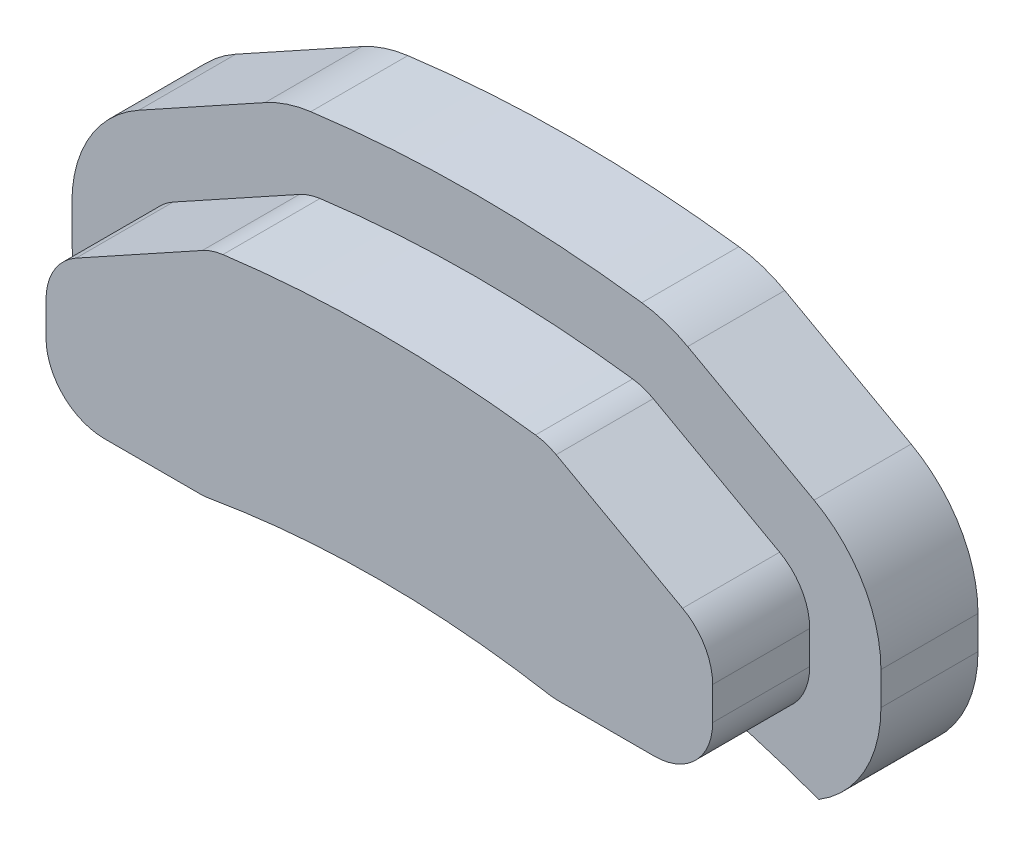
ISO-10303-21;
HEADER;
FILE_DESCRIPTION(('STEP AP214'),'2;1');
FILE_NAME('part.step','',(''),(''),'','','');
FILE_SCHEMA(('AUTOMOTIVE_DESIGN { 1 0 10303 214 1 1 1 1 }'));
ENDSEC;
DATA;
#1=APPLICATION_CONTEXT('core data for automotive mechanical design processes');
#2=APPLICATION_PROTOCOL_DEFINITION('international standard','automotive_design',2000,#1);
#3=PRODUCT_CONTEXT('',#1,'mechanical');
#4=PRODUCT('Part','Part','',(#3));
#5=PRODUCT_RELATED_PRODUCT_CATEGORY('part','',(#4));
#6=PRODUCT_DEFINITION_FORMATION('','',#4);
#7=PRODUCT_DEFINITION_CONTEXT('part definition',#1,'design');
#8=PRODUCT_DEFINITION('design','',#6,#7);
#9=PRODUCT_DEFINITION_SHAPE('','',#8);
#10=(LENGTH_UNIT() NAMED_UNIT(*) SI_UNIT(.MILLI.,.METRE.));
#11=(NAMED_UNIT(*) PLANE_ANGLE_UNIT() SI_UNIT($,.RADIAN.));
#12=(NAMED_UNIT(*) SI_UNIT($,.STERADIAN.) SOLID_ANGLE_UNIT());
#13=UNCERTAINTY_MEASURE_WITH_UNIT(LENGTH_MEASURE(1.E-05),#10,'distance_accuracy_value','');
#14=(GEOMETRIC_REPRESENTATION_CONTEXT(3) GLOBAL_UNCERTAINTY_ASSIGNED_CONTEXT((#13)) GLOBAL_UNIT_ASSIGNED_CONTEXT((#10,
#11,#12)) REPRESENTATION_CONTEXT('',''));
#15=CARTESIAN_POINT('',(0.,0.,0.));
#16=DIRECTION('',(0.,0.,1.));
#17=DIRECTION('',(1.,0.,0.));
#18=AXIS2_PLACEMENT_3D('',#15,#16,#17);
#19=CARTESIAN_POINT('',(0.,0.,5.));
#20=DIRECTION('',(0.,0.,-1.));
#21=DIRECTION('',(-1.,0.,0.));
#22=AXIS2_PLACEMENT_3D('',#19,#20,#21);
#23=CYLINDRICAL_SURFACE('',#22,37.2749973663737);
#24=DIRECTION('',(0.,0.,-1.));
#25=VECTOR('',#24,1.);
#26=CARTESIAN_POINT('',(4.82118506602281,36.9618939344607,5.));
#27=LINE('',#26,#25);
#28=CARTESIAN_POINT('',(4.82118506602281,36.9618939344607,6.));
#29=VERTEX_POINT('',#28);
#30=CARTESIAN_POINT('',(4.82118506602281,36.9618939344607,3.));
#31=VERTEX_POINT('',#30);
#32=EDGE_CURVE('E230',#29,#31,#27,.T.);
#33=ORIENTED_EDGE('',*,*,#32,.T.);
#34=CARTESIAN_POINT('',(0.,0.,3.));
#35=DIRECTION('',(0.,0.,1.));
#36=DIRECTION('',(0.,-1.,0.));
#37=AXIS2_PLACEMENT_3D('',#34,#35,#36);
#38=CIRCLE('',#37,37.2749973663737);
#39=CARTESIAN_POINT('',(-4.83917483618195,36.9595429566983,3.));
#40=VERTEX_POINT('',#39);
#41=EDGE_CURVE('E49',#40,#31,#38,.F.);
#42=ORIENTED_EDGE('',*,*,#41,.F.);
#43=DIRECTION('',(0.,0.,-1.));
#44=VECTOR('',#43,1.);
#45=CARTESIAN_POINT('',(-4.83917483618195,36.9595429566983,5.));
#46=LINE('',#45,#44);
#47=CARTESIAN_POINT('',(-4.83917483618195,36.9595429566983,6.));
#48=VERTEX_POINT('',#47);
#49=EDGE_CURVE('E11',#48,#40,#46,.T.);
#50=ORIENTED_EDGE('',*,*,#49,.F.);
#51=CARTESIAN_POINT('',(0.,0.,6.));
#52=DIRECTION('',(0.,0.,1.));
#53=DIRECTION('',(1.,0.,0.));
#54=AXIS2_PLACEMENT_3D('',#51,#52,#53);
#55=CIRCLE('',#54,37.2749973663737);
#56=EDGE_CURVE('E242',#29,#48,#55,.T.);
#57=ORIENTED_EDGE('',*,*,#56,.F.);
#58=EDGE_LOOP('',(#33,#42,#50,#57));
#59=FACE_BOUND('',#58,.T.);
#60=ADVANCED_FACE('F35',(#59),#23,.T.);
#61=CARTESIAN_POINT('',(-4.60549233261227,35.1747761687046,5.));
#62=DIRECTION('',(0.,0.,-1.));
#63=DIRECTION('',(-1.,0.,0.));
#64=AXIS2_PLACEMENT_3D('',#61,#62,#63);
#65=CYLINDRICAL_SURFACE('',#64,1.8);
#66=ORIENTED_EDGE('',*,*,#49,.T.);
#67=CARTESIAN_POINT('',(-4.60549233261227,35.1747761687046,3.));
#68=DIRECTION('',(0.,0.,1.));
#69=DIRECTION('',(0.,-1.,0.));
#70=AXIS2_PLACEMENT_3D('',#67,#68,#69);
#71=CIRCLE('',#70,1.8);
#72=CARTESIAN_POINT('',(-5.47583386372935,36.7503730775657,3.00000000000001));
#73=VERTEX_POINT('',#72);
#74=EDGE_CURVE('E330',#73,#40,#71,.F.);
#75=ORIENTED_EDGE('',*,*,#74,.F.);
#76=DIRECTION('',(0.,0.,-1.));
#77=VECTOR('',#76,1.);
#78=CARTESIAN_POINT('',(-5.47583386372935,36.7503730775657,5.));
#79=LINE('',#78,#77);
#80=CARTESIAN_POINT('',(-5.47583386372935,36.7503730775657,6.));
#81=VERTEX_POINT('',#80);
#82=EDGE_CURVE('E42',#81,#73,#79,.T.);
#83=ORIENTED_EDGE('',*,*,#82,.F.);
#84=CARTESIAN_POINT('',(-4.60549233261227,35.1747761687046,6.));
#85=DIRECTION('',(0.,0.,1.));
#86=DIRECTION('',(1.,0.,0.));
#87=AXIS2_PLACEMENT_3D('',#84,#85,#86);
#88=CIRCLE('',#87,1.8);
#89=EDGE_CURVE('E246',#48,#81,#88,.T.);
#90=ORIENTED_EDGE('',*,*,#89,.F.);
#91=EDGE_LOOP('',(#66,#75,#83,#90));
#92=FACE_BOUND('',#91,.T.);
#93=ADVANCED_FACE('F472',(#92),#65,.T.);
#94=CARTESIAN_POINT('',(-16.8345595353187,30.4759442328838,5.));
#95=DIRECTION('',(0.483523072842823,-0.875331616033966,0.));
#96=DIRECTION('',(0.875331616033966,0.483523072842823,0.));
#97=AXIS2_PLACEMENT_3D('',#94,#95,#96);
#98=PLANE('',#97);
#99=ORIENTED_EDGE('',*,*,#82,.T.);
#100=DIRECTION('',(0.875331616033965,0.483523072842823,0.));
#101=VECTOR('',#100,1.);
#102=CARTESIAN_POINT('',(-16.8345595353187,30.4759442328838,3.));
#103=LINE('',#102,#101);
#104=CARTESIAN_POINT('',(-9.37696079420415,34.5954356270946,3.00000000000001));
#105=VERTEX_POINT('',#104);
#106=EDGE_CURVE('E55',#105,#73,#103,.T.);
#107=ORIENTED_EDGE('',*,*,#106,.F.);
#108=DIRECTION('',(0.,0.,-1.));
#109=VECTOR('',#108,1.);
#110=CARTESIAN_POINT('',(-9.37696079420415,34.5954356270946,5.));
#111=LINE('',#110,#109);
#112=CARTESIAN_POINT('',(-9.37696079420415,34.5954356270946,6.));
#113=VERTEX_POINT('',#112);
#114=EDGE_CURVE('E465',#113,#105,#111,.T.);
#115=ORIENTED_EDGE('',*,*,#114,.F.);
#116=DIRECTION('',(-0.875331616033966,-0.483523072842823,0.));
#117=VECTOR('',#116,1.);
#118=CARTESIAN_POINT('',(-5.47583386372935,36.7503730775657,6.));
#119=LINE('',#118,#117);
#120=EDGE_CURVE('E256',#81,#113,#119,.T.);
#121=ORIENTED_EDGE('',*,*,#120,.F.);
#122=EDGE_LOOP('',(#99,#107,#115,#121));
#123=FACE_BOUND('',#122,.T.);
#124=ADVANCED_FACE('F470',(#123),#98,.F.);
#125=CARTESIAN_POINT('',(-8.50661926308708,33.0198387182334,5.));
#126=DIRECTION('',(0.,0.,-1.));
#127=DIRECTION('',(-1.,0.,0.));
#128=AXIS2_PLACEMENT_3D('',#125,#126,#127);
#129=CYLINDRICAL_SURFACE('',#128,1.8);
#130=ORIENTED_EDGE('',*,*,#114,.T.);
#131=CARTESIAN_POINT('',(-8.50661926308708,33.0198387182334,3.));
#132=DIRECTION('',(0.,0.,1.));
#133=DIRECTION('',(0.,-1.,0.));
#134=AXIS2_PLACEMENT_3D('',#131,#132,#133);
#135=CIRCLE('',#134,1.8);
#136=CARTESIAN_POINT('',(-10.3066192630871,33.0198387182334,3.00000000000001));
#137=VERTEX_POINT('',#136);
#138=EDGE_CURVE('E333',#137,#105,#135,.F.);
#139=ORIENTED_EDGE('',*,*,#138,.F.);
#140=DIRECTION('',(0.,0.,-1.));
#141=VECTOR('',#140,1.);
#142=CARTESIAN_POINT('',(-10.3066192630871,33.0198387182334,5.));
#143=LINE('',#142,#141);
#144=CARTESIAN_POINT('',(-10.3066192630871,33.0198387182334,6.));
#145=VERTEX_POINT('',#144);
#146=EDGE_CURVE('E462',#145,#137,#143,.T.);
#147=ORIENTED_EDGE('',*,*,#146,.F.);
#148=CARTESIAN_POINT('',(-8.50661926308708,33.0198387182334,6.));
#149=DIRECTION('',(0.,0.,1.));
#150=DIRECTION('',(1.,0.,0.));
#151=AXIS2_PLACEMENT_3D('',#148,#149,#150);
#152=CIRCLE('',#151,1.8);
#153=EDGE_CURVE('E259',#113,#145,#152,.T.);
#154=ORIENTED_EDGE('',*,*,#153,.F.);
#155=EDGE_LOOP('',(#130,#139,#147,#154));
#156=FACE_BOUND('',#155,.T.);
#157=ADVANCED_FACE('F476',(#156),#129,.T.);
#158=CARTESIAN_POINT('',(-10.3066192630871,0.,5.));
#159=DIRECTION('',(-1.,0.,0.));
#160=DIRECTION('',(0.,-1.,0.));
#161=AXIS2_PLACEMENT_3D('',#158,#159,#160);
#162=PLANE('',#161);
#163=DIRECTION('',(0.,1.,0.));
#164=VECTOR('',#163,1.);
#165=CARTESIAN_POINT('',(-10.3066192630871,0.,3.));
#166=LINE('',#165,#164);
#167=CARTESIAN_POINT('',(-10.3066192630871,31.9999765529127,3.00000000000001));
#168=VERTEX_POINT('',#167);
#169=EDGE_CURVE('E335',#168,#137,#166,.T.);
#170=ORIENTED_EDGE('',*,*,#169,.F.);
#171=DIRECTION('',(0.,0.,-1.));
#172=VECTOR('',#171,1.);
#173=CARTESIAN_POINT('',(-10.3066192630871,31.9999765529127,5.));
#174=LINE('',#173,#172);
#175=CARTESIAN_POINT('',(-10.3066192630871,31.9999765529127,6.));
#176=VERTEX_POINT('',#175);
#177=EDGE_CURVE('E459',#176,#168,#174,.T.);
#178=ORIENTED_EDGE('',*,*,#177,.F.);
#179=DIRECTION('',(0.,-1.,0.));
#180=VECTOR('',#179,1.);
#181=CARTESIAN_POINT('',(-10.3066192630871,33.0198387182334,6.));
#182=LINE('',#181,#180);
#183=EDGE_CURVE('E262',#145,#176,#182,.T.);
#184=ORIENTED_EDGE('',*,*,#183,.F.);
#185=ORIENTED_EDGE('',*,*,#146,.T.);
#186=EDGE_LOOP('',(#170,#178,#184,#185));
#187=FACE_BOUND('',#186,.T.);
#188=ADVANCED_FACE('F480',(#187),#162,.T.);
#189=CARTESIAN_POINT('',(-8.50661926308708,31.9999765529127,5.));
#190=DIRECTION('',(0.,0.,-1.));
#191=DIRECTION('',(-1.,0.,0.));
#192=AXIS2_PLACEMENT_3D('',#189,#190,#191);
#193=CYLINDRICAL_SURFACE('',#192,1.8);
#194=CARTESIAN_POINT('',(-8.50661926308708,31.9999765529127,3.));
#195=DIRECTION('',(0.,0.,1.));
#196=DIRECTION('',(0.,-1.,0.));
#197=AXIS2_PLACEMENT_3D('',#194,#195,#196);
#198=CIRCLE('',#197,1.8);
#199=CARTESIAN_POINT('',(-8.50661926308707,30.1999765529127,3.00000000000001));
#200=VERTEX_POINT('',#199);
#201=EDGE_CURVE('E337',#200,#168,#198,.F.);
#202=ORIENTED_EDGE('',*,*,#201,.F.);
#203=DIRECTION('',(0.,0.,-1.));
#204=VECTOR('',#203,1.);
#205=CARTESIAN_POINT('',(-8.50661926308707,30.1999765529127,5.));
#206=LINE('',#205,#204);
#207=CARTESIAN_POINT('',(-8.50661926308707,30.1999765529127,6.));
#208=VERTEX_POINT('',#207);
#209=EDGE_CURVE('E456',#208,#200,#206,.T.);
#210=ORIENTED_EDGE('',*,*,#209,.F.);
#211=CARTESIAN_POINT('',(-8.50661926308708,31.9999765529127,6.));
#212=DIRECTION('',(0.,0.,1.));
#213=DIRECTION('',(1.,0.,0.));
#214=AXIS2_PLACEMENT_3D('',#211,#212,#213);
#215=CIRCLE('',#214,1.8);
#216=EDGE_CURVE('E265',#176,#208,#215,.T.);
#217=ORIENTED_EDGE('',*,*,#216,.F.);
#218=ORIENTED_EDGE('',*,*,#177,.T.);
#219=EDGE_LOOP('',(#202,#210,#217,#218));
#220=FACE_BOUND('',#219,.T.);
#221=ADVANCED_FACE('F485',(#220),#193,.T.);
#222=CARTESIAN_POINT('',(0.,30.1999765529127,5.));
#223=DIRECTION('',(0.,-1.,0.));
#224=DIRECTION('',(1.,0.,0.));
#225=AXIS2_PLACEMENT_3D('',#222,#223,#224);
#226=PLANE('',#225);
#227=DIRECTION('',(-1.,0.,0.));
#228=VECTOR('',#227,1.);
#229=CARTESIAN_POINT('',(0.,30.1999765529127,3.));
#230=LINE('',#229,#228);
#231=CARTESIAN_POINT('',(-5.55240258135264,30.1999765529127,3.00000000000001));
#232=VERTEX_POINT('',#231);
#233=EDGE_CURVE('E339',#232,#200,#230,.T.);
#234=ORIENTED_EDGE('',*,*,#233,.F.);
#235=DIRECTION('',(0.,0.,-1.));
#236=VECTOR('',#235,1.);
#237=CARTESIAN_POINT('',(-5.55240258135264,30.1999765529127,5.));
#238=LINE('',#237,#236);
#239=CARTESIAN_POINT('',(-5.55240258135264,30.1999765529127,6.));
#240=VERTEX_POINT('',#239);
#241=EDGE_CURVE('E453',#240,#232,#238,.T.);
#242=ORIENTED_EDGE('',*,*,#241,.F.);
#243=DIRECTION('',(1.,0.,0.));
#244=VECTOR('',#243,1.);
#245=CARTESIAN_POINT('',(-8.50661926308707,30.1999765529127,6.));
#246=LINE('',#245,#244);
#247=EDGE_CURVE('E268',#208,#240,#246,.T.);
#248=ORIENTED_EDGE('',*,*,#247,.F.);
#249=ORIENTED_EDGE('',*,*,#209,.T.);
#250=EDGE_LOOP('',(#234,#242,#248,#249));
#251=FACE_BOUND('',#250,.T.);
#252=ADVANCED_FACE('F488',(#251),#226,.T.);
#253=CARTESIAN_POINT('',(-5.55240258135264,31.9999765529127,5.));
#254=DIRECTION('',(0.,0.,-1.));
#255=DIRECTION('',(-1.,0.,0.));
#256=AXIS2_PLACEMENT_3D('',#253,#254,#255);
#257=CYLINDRICAL_SURFACE('',#256,1.8);
#258=ORIENTED_EDGE('',*,*,#241,.T.);
#259=CARTESIAN_POINT('',(-5.55240258135264,31.9999765529127,3.));
#260=DIRECTION('',(0.,0.,1.));
#261=DIRECTION('',(0.,-1.,0.));
#262=AXIS2_PLACEMENT_3D('',#259,#260,#261);
#263=CIRCLE('',#262,1.8);
#264=CARTESIAN_POINT('',(-5.24565913854989,30.2263056532536,3.00000000000001));
#265=VERTEX_POINT('',#264);
#266=EDGE_CURVE('E341',#265,#232,#263,.F.);
#267=ORIENTED_EDGE('',*,*,#266,.F.);
#268=DIRECTION('',(0.,0.,-1.));
#269=VECTOR('',#268,1.);
#270=CARTESIAN_POINT('',(-5.24565913854989,30.2263056532536,5.));
#271=LINE('',#270,#269);
#272=CARTESIAN_POINT('',(-5.24565913854989,30.2263056532536,6.));
#273=VERTEX_POINT('',#272);
#274=EDGE_CURVE('E450',#273,#265,#271,.T.);
#275=ORIENTED_EDGE('',*,*,#274,.F.);
#276=CARTESIAN_POINT('',(-5.55240258135264,31.9999765529127,6.));
#277=DIRECTION('',(0.,0.,1.));
#278=DIRECTION('',(1.,0.,0.));
#279=AXIS2_PLACEMENT_3D('',#276,#277,#278);
#280=CIRCLE('',#279,1.8);
#281=EDGE_CURVE('E271',#240,#273,#280,.T.);
#282=ORIENTED_EDGE('',*,*,#281,.F.);
#283=EDGE_LOOP('',(#258,#267,#275,#282));
#284=FACE_BOUND('',#283,.T.);
#285=ADVANCED_FACE('F492',(#284),#257,.T.);
#286=CARTESIAN_POINT('',(-0.0182400829238189,0.,5.));
#287=DIRECTION('',(0.,0.,-1.));
#288=DIRECTION('',(-1.,0.,0.));
#289=AXIS2_PLACEMENT_3D('',#286,#287,#288);
#290=CYLINDRICAL_SURFACE('',#289,30.6749973663737);
#291=ORIENTED_EDGE('',*,*,#274,.T.);
#292=CARTESIAN_POINT('',(-0.0182400829238189,0.,3.));
#293=DIRECTION('',(0.,0.,1.));
#294=DIRECTION('',(0.,-1.,0.));
#295=AXIS2_PLACEMENT_3D('',#292,#293,#294);
#296=CIRCLE('',#295,30.6749973663737);
#297=CARTESIAN_POINT('',(-0.00912004145607898,30.6749960106253,3.00000000000001));
#298=VERTEX_POINT('',#297);
#299=EDGE_CURVE('E343',#298,#265,#296,.T.);
#300=ORIENTED_EDGE('',*,*,#299,.F.);
#301=DIRECTION('',(0.,0.,-1.));
#302=VECTOR('',#301,1.);
#303=CARTESIAN_POINT('',(-0.00912004145607592,30.6749960106253,5.));
#304=LINE('',#303,#302);
#305=CARTESIAN_POINT('',(-0.00912004145607898,30.6749960106253,6.));
#306=VERTEX_POINT('',#305);
#307=EDGE_CURVE('E447',#306,#298,#304,.T.);
#308=ORIENTED_EDGE('',*,*,#307,.F.);
#309=CARTESIAN_POINT('',(-0.0182400829238189,0.,6.));
#310=DIRECTION('',(0.,0.,-1.));
#311=DIRECTION('',(1.,0.,0.));
#312=AXIS2_PLACEMENT_3D('',#309,#310,#311);
#313=CIRCLE('',#312,30.6749973663737);
#314=EDGE_CURVE('E274',#273,#306,#313,.T.);
#315=ORIENTED_EDGE('',*,*,#314,.F.);
#316=EDGE_LOOP('',(#291,#300,#308,#315));
#317=FACE_BOUND('',#316,.T.);
#318=ADVANCED_FACE('F496',(#317),#290,.F.);
#319=CARTESIAN_POINT('',(0.,0.,5.));
#320=DIRECTION('',(0.,0.,-1.));
#321=DIRECTION('',(-1.,0.,0.));
#322=AXIS2_PLACEMENT_3D('',#319,#320,#321);
#323=CYLINDRICAL_SURFACE('',#322,30.6749973663737);
#324=CARTESIAN_POINT('',(0.,0.,3.));
#325=DIRECTION('',(0.,0.,1.));
#326=DIRECTION('',(0.,-1.,0.));
#327=AXIS2_PLACEMENT_3D('',#324,#325,#326);
#328=CIRCLE('',#327,30.6749973663737);
#329=CARTESIAN_POINT('',(5.22741905562607,30.2263056532536,3.00000000000001));
#330=VERTEX_POINT('',#329);
#331=EDGE_CURVE('E345',#330,#298,#328,.T.);
#332=ORIENTED_EDGE('',*,*,#331,.F.);
#333=DIRECTION('',(0.,0.,-1.));
#334=VECTOR('',#333,1.);
#335=CARTESIAN_POINT('',(5.22741905562607,30.2263056532536,5.));
#336=LINE('',#335,#334);
#337=CARTESIAN_POINT('',(5.22741905562607,30.2263056532536,6.));
#338=VERTEX_POINT('',#337);
#339=EDGE_CURVE('E444',#338,#330,#336,.T.);
#340=ORIENTED_EDGE('',*,*,#339,.F.);
#341=CARTESIAN_POINT('',(0.,0.,6.));
#342=DIRECTION('',(0.,0.,-1.));
#343=DIRECTION('',(1.,0.,0.));
#344=AXIS2_PLACEMENT_3D('',#341,#342,#343);
#345=CIRCLE('',#344,30.6749973663737);
#346=EDGE_CURVE('E277',#306,#338,#345,.T.);
#347=ORIENTED_EDGE('',*,*,#346,.F.);
#348=ORIENTED_EDGE('',*,*,#307,.T.);
#349=EDGE_LOOP('',(#332,#340,#347,#348));
#350=FACE_BOUND('',#349,.T.);
#351=ADVANCED_FACE('F501',(#350),#323,.F.);
#352=CARTESIAN_POINT('',(5.53416249842883,31.9999765529127,5.));
#353=DIRECTION('',(0.,0.,-1.));
#354=DIRECTION('',(-1.,0.,0.));
#355=AXIS2_PLACEMENT_3D('',#352,#353,#354);
#356=CYLINDRICAL_SURFACE('',#355,1.8);
#357=CARTESIAN_POINT('',(5.53416249842883,31.9999765529127,3.));
#358=DIRECTION('',(0.,0.,1.));
#359=DIRECTION('',(0.,-1.,0.));
#360=AXIS2_PLACEMENT_3D('',#357,#358,#359);
#361=CIRCLE('',#360,1.8);
#362=CARTESIAN_POINT('',(5.53416249842883,30.1999765529127,3.00000000000001));
#363=VERTEX_POINT('',#362);
#364=EDGE_CURVE('E347',#363,#330,#361,.F.);
#365=ORIENTED_EDGE('',*,*,#364,.F.);
#366=DIRECTION('',(0.,0.,-1.));
#367=VECTOR('',#366,1.);
#368=CARTESIAN_POINT('',(5.53416249842883,30.1999765529127,5.));
#369=LINE('',#368,#367);
#370=CARTESIAN_POINT('',(5.53416249842883,30.1999765529127,6.));
#371=VERTEX_POINT('',#370);
#372=EDGE_CURVE('E441',#371,#363,#369,.T.);
#373=ORIENTED_EDGE('',*,*,#372,.F.);
#374=CARTESIAN_POINT('',(5.53416249842883,31.9999765529127,6.));
#375=DIRECTION('',(0.,0.,1.));
#376=DIRECTION('',(1.,0.,0.));
#377=AXIS2_PLACEMENT_3D('',#374,#375,#376);
#378=CIRCLE('',#377,1.8);
#379=EDGE_CURVE('E280',#338,#371,#378,.T.);
#380=ORIENTED_EDGE('',*,*,#379,.F.);
#381=ORIENTED_EDGE('',*,*,#339,.T.);
#382=EDGE_LOOP('',(#365,#373,#380,#381));
#383=FACE_BOUND('',#382,.T.);
#384=ADVANCED_FACE('F504',(#383),#356,.T.);
#385=CARTESIAN_POINT('',(0.,30.1999765529127,5.));
#386=DIRECTION('',(0.,1.,0.));
#387=DIRECTION('',(-1.,0.,0.));
#388=AXIS2_PLACEMENT_3D('',#385,#386,#387);
#389=PLANE('',#388);
#390=ORIENTED_EDGE('',*,*,#372,.T.);
#391=DIRECTION('',(-1.,0.,0.));
#392=VECTOR('',#391,1.);
#393=CARTESIAN_POINT('',(0.,30.1999765529127,3.));
#394=LINE('',#393,#392);
#395=CARTESIAN_POINT('',(8.4935487147277,30.1999765529127,3.00000000000001));
#396=VERTEX_POINT('',#395);
#397=EDGE_CURVE('E349',#396,#363,#394,.T.);
#398=ORIENTED_EDGE('',*,*,#397,.F.);
#399=DIRECTION('',(0.,0.,-1.));
#400=VECTOR('',#399,1.);
#401=CARTESIAN_POINT('',(8.4935487147277,30.1999765529127,5.));
#402=LINE('',#401,#400);
#403=CARTESIAN_POINT('',(8.4935487147277,30.1999765529127,6.));
#404=VERTEX_POINT('',#403);
#405=EDGE_CURVE('E438',#404,#396,#402,.T.);
#406=ORIENTED_EDGE('',*,*,#405,.F.);
#407=DIRECTION('',(1.,0.,0.));
#408=VECTOR('',#407,1.);
#409=CARTESIAN_POINT('',(5.53416249842883,30.1999765529127,6.));
#410=LINE('',#409,#408);
#411=EDGE_CURVE('E283',#371,#404,#410,.T.);
#412=ORIENTED_EDGE('',*,*,#411,.F.);
#413=EDGE_LOOP('',(#390,#398,#406,#412));
#414=FACE_BOUND('',#413,.T.);
#415=ADVANCED_FACE('F508',(#414),#389,.F.);
#416=CARTESIAN_POINT('',(8.49354871472771,31.9999765529127,5.));
#417=DIRECTION('',(0.,0.,-1.));
#418=DIRECTION('',(-1.,0.,0.));
#419=AXIS2_PLACEMENT_3D('',#416,#417,#418);
#420=CYLINDRICAL_SURFACE('',#419,1.8);
#421=ORIENTED_EDGE('',*,*,#405,.T.);
#422=CARTESIAN_POINT('',(8.49354871472771,31.9999765529127,3.));
#423=DIRECTION('',(0.,0.,1.));
#424=DIRECTION('',(0.,-1.,0.));
#425=AXIS2_PLACEMENT_3D('',#422,#423,#424);
#426=CIRCLE('',#425,1.8);
#427=CARTESIAN_POINT('',(10.2935487147277,31.9999765529127,3.00000000000001));
#428=VERTEX_POINT('',#427);
#429=EDGE_CURVE('E351',#428,#396,#426,.F.);
#430=ORIENTED_EDGE('',*,*,#429,.F.);
#431=DIRECTION('',(0.,0.,-1.));
#432=VECTOR('',#431,1.);
#433=CARTESIAN_POINT('',(10.2935487147277,31.9999765529127,5.));
#434=LINE('',#433,#432);
#435=CARTESIAN_POINT('',(10.2935487147277,31.9999765529127,6.));
#436=VERTEX_POINT('',#435);
#437=EDGE_CURVE('E435',#436,#428,#434,.T.);
#438=ORIENTED_EDGE('',*,*,#437,.F.);
#439=CARTESIAN_POINT('',(8.49354871472771,31.9999765529127,6.));
#440=DIRECTION('',(0.,0.,1.));
#441=DIRECTION('',(1.,0.,0.));
#442=AXIS2_PLACEMENT_3D('',#439,#440,#441);
#443=CIRCLE('',#442,1.8);
#444=EDGE_CURVE('E286',#404,#436,#443,.T.);
#445=ORIENTED_EDGE('',*,*,#444,.F.);
#446=EDGE_LOOP('',(#421,#430,#438,#445));
#447=FACE_BOUND('',#446,.T.);
#448=ADVANCED_FACE('F512',(#447),#420,.T.);
#449=CARTESIAN_POINT('',(10.2935487147278,0.,5.));
#450=DIRECTION('',(-1.,0.,0.));
#451=DIRECTION('',(0.,-1.,0.));
#452=AXIS2_PLACEMENT_3D('',#449,#450,#451);
#453=PLANE('',#452);
#454=ORIENTED_EDGE('',*,*,#437,.T.);
#455=DIRECTION('',(0.,-1.,0.));
#456=VECTOR('',#455,1.);
#457=CARTESIAN_POINT('',(10.2935487147278,0.,3.));
#458=LINE('',#457,#456);
#459=CARTESIAN_POINT('',(10.2935487147277,33.0198387182333,3.00000000000001));
#460=VERTEX_POINT('',#459);
#461=EDGE_CURVE('E353',#460,#428,#458,.T.);
#462=ORIENTED_EDGE('',*,*,#461,.F.);
#463=DIRECTION('',(0.,0.,-1.));
#464=VECTOR('',#463,1.);
#465=CARTESIAN_POINT('',(10.2935487147277,33.0198387182333,5.));
#466=LINE('',#465,#464);
#467=CARTESIAN_POINT('',(10.2935487147277,33.0198387182333,6.));
#468=VERTEX_POINT('',#467);
#469=EDGE_CURVE('E432',#468,#460,#466,.T.);
#470=ORIENTED_EDGE('',*,*,#469,.F.);
#471=DIRECTION('',(0.,1.,0.));
#472=VECTOR('',#471,1.);
#473=CARTESIAN_POINT('',(10.2935487147277,31.9999765529127,6.));
#474=LINE('',#473,#472);
#475=EDGE_CURVE('E289',#436,#468,#474,.T.);
#476=ORIENTED_EDGE('',*,*,#475,.F.);
#477=EDGE_LOOP('',(#454,#462,#470,#476));
#478=FACE_BOUND('',#477,.T.);
#479=ADVANCED_FACE('F516',(#478),#453,.F.);
#480=CARTESIAN_POINT('',(8.49354871472771,33.0198387182333,5.));
#481=DIRECTION('',(0.,0.,-1.));
#482=DIRECTION('',(-1.,0.,0.));
#483=AXIS2_PLACEMENT_3D('',#480,#481,#482);
#484=CYLINDRICAL_SURFACE('',#483,1.8);
#485=ORIENTED_EDGE('',*,*,#469,.T.);
#486=CARTESIAN_POINT('',(8.49354871472771,33.0198387182333,3.));
#487=DIRECTION('',(0.,0.,1.));
#488=DIRECTION('',(0.,-1.,0.));
#489=AXIS2_PLACEMENT_3D('',#486,#487,#488);
#490=CIRCLE('',#489,1.8);
#491=CARTESIAN_POINT('',(9.36389024584479,34.5954356270945,3.00000000000001));
#492=VERTEX_POINT('',#491);
#493=EDGE_CURVE('E355',#492,#460,#490,.F.);
#494=ORIENTED_EDGE('',*,*,#493,.F.);
#495=DIRECTION('',(0.,0.,-1.));
#496=VECTOR('',#495,1.);
#497=CARTESIAN_POINT('',(9.3638902458448,34.5954356270945,5.));
#498=LINE('',#497,#496);
#499=CARTESIAN_POINT('',(9.3638902458448,34.5954356270945,6.));
#500=VERTEX_POINT('',#499);
#501=EDGE_CURVE('E429',#500,#492,#498,.T.);
#502=ORIENTED_EDGE('',*,*,#501,.F.);
#503=CARTESIAN_POINT('',(8.49354871472771,33.0198387182333,6.));
#504=DIRECTION('',(0.,0.,1.));
#505=DIRECTION('',(1.,0.,0.));
#506=AXIS2_PLACEMENT_3D('',#503,#504,#505);
#507=CIRCLE('',#506,1.8);
#508=EDGE_CURVE('E292',#468,#500,#507,.T.);
#509=ORIENTED_EDGE('',*,*,#508,.F.);
#510=EDGE_LOOP('',(#485,#494,#502,#509));
#511=FACE_BOUND('',#510,.T.);
#512=ADVANCED_FACE('F520',(#511),#484,.T.);
#513=CARTESIAN_POINT('',(16.8315037121905,30.4704122143563,5.));
#514=DIRECTION('',(0.483523072842832,0.875331616033961,0.));
#515=DIRECTION('',(-0.875331616033961,0.483523072842832,0.));
#516=AXIS2_PLACEMENT_3D('',#513,#514,#515);
#517=PLANE('',#516);
#518=DIRECTION('',(0.875331616033961,-0.483523072842832,0.));
#519=VECTOR('',#518,1.);
#520=CARTESIAN_POINT('',(16.8315037121905,30.4704122143563,3.));
#521=LINE('',#520,#519);
#522=CARTESIAN_POINT('',(5.45871281492701,36.7526105272189,3.00000000000001));
#523=VERTEX_POINT('',#522);
#524=EDGE_CURVE('E357',#523,#492,#521,.T.);
#525=ORIENTED_EDGE('',*,*,#524,.F.);
#526=DIRECTION('',(0.,0.,-1.));
#527=VECTOR('',#526,1.);
#528=CARTESIAN_POINT('',(5.45871281492701,36.7526105272189,5.));
#529=LINE('',#528,#527);
#530=CARTESIAN_POINT('',(5.45871281492701,36.7526105272189,6.));
#531=VERTEX_POINT('',#530);
#532=EDGE_CURVE('E238',#531,#523,#529,.T.);
#533=ORIENTED_EDGE('',*,*,#532,.F.);
#534=DIRECTION('',(-0.87533161603396,0.483523072842833,0.));
#535=VECTOR('',#534,1.);
#536=CARTESIAN_POINT('',(9.3638902458448,34.5954356270945,6.));
#537=LINE('',#536,#535);
#538=EDGE_CURVE('E252',#500,#531,#537,.T.);
#539=ORIENTED_EDGE('',*,*,#538,.F.);
#540=ORIENTED_EDGE('',*,*,#501,.T.);
#541=EDGE_LOOP('',(#525,#533,#539,#540));
#542=FACE_BOUND('',#541,.T.);
#543=ADVANCED_FACE('F523',(#542),#517,.T.);
#544=CARTESIAN_POINT('',(4.58837128380992,35.1770136183578,5.));
#545=DIRECTION('',(0.,0.,-1.));
#546=DIRECTION('',(-1.,0.,0.));
#547=AXIS2_PLACEMENT_3D('',#544,#545,#546);
#548=CYLINDRICAL_SURFACE('',#547,1.8);
#549=ORIENTED_EDGE('',*,*,#532,.T.);
#550=CARTESIAN_POINT('',(4.58837128380992,35.1770136183578,3.));
#551=DIRECTION('',(0.,0.,1.));
#552=DIRECTION('',(0.,-1.,0.));
#553=AXIS2_PLACEMENT_3D('',#550,#551,#552);
#554=CIRCLE('',#553,1.8);
#555=EDGE_CURVE('E236',#31,#523,#554,.F.);
#556=ORIENTED_EDGE('',*,*,#555,.F.);
#557=ORIENTED_EDGE('',*,*,#32,.F.);
#558=CARTESIAN_POINT('',(4.58837128380992,35.1770136183578,6.));
#559=DIRECTION('',(0.,0.,1.));
#560=DIRECTION('',(1.,0.,0.));
#561=AXIS2_PLACEMENT_3D('',#558,#559,#560);
#562=CIRCLE('',#561,1.8);
#563=EDGE_CURVE('E235',#531,#29,#562,.T.);
#564=ORIENTED_EDGE('',*,*,#563,.F.);
#565=EDGE_LOOP('',(#549,#556,#557,#564));
#566=FACE_BOUND('',#565,.T.);
#567=ADVANCED_FACE('F233',(#566),#548,.T.);
#568=CARTESIAN_POINT('',(0.,0.,30.2700613463451));
#569=DIRECTION('',(0.,0.,-1.));
#570=DIRECTION('',(-1.,0.,0.));
#571=AXIS2_PLACEMENT_3D('',#568,#569,#570);
#572=CYLINDRICAL_SURFACE('',#571,39.4749973663737);
#573=DIRECTION('',(0.,0.,-1.));
#574=VECTOR('',#573,1.);
#575=CARTESIAN_POINT('',(-5.12478678498934,39.1409245864684,30.2700613463451));
#576=LINE('',#575,#574);
#577=CARTESIAN_POINT('',(-5.12478678498934,39.1409245864684,3.));
#578=VERTEX_POINT('',#577);
#579=CARTESIAN_POINT('',(-5.12478678498934,39.1409245864684,0.));
#580=VERTEX_POINT('',#579);
#581=EDGE_CURVE('E400',#578,#580,#576,.T.);
#582=ORIENTED_EDGE('',*,*,#581,.F.);
#583=CARTESIAN_POINT('',(0.,0.,3.));
#584=DIRECTION('',(0.,0.,1.));
#585=DIRECTION('',(0.,-1.,0.));
#586=AXIS2_PLACEMENT_3D('',#583,#584,#585);
#587=CIRCLE('',#586,39.4749973663737);
#588=CARTESIAN_POINT('',(5.10573524428301,39.1434143208088,3.00000000000001));
#589=VERTEX_POINT('',#588);
#590=EDGE_CURVE('E239',#578,#589,#587,.F.);
#591=ORIENTED_EDGE('',*,*,#590,.T.);
#592=DIRECTION('',(0.,0.,-1.));
#593=VECTOR('',#592,1.);
#594=CARTESIAN_POINT('',(5.10573524428301,39.1434143208088,30.2700613463451));
#595=LINE('',#594,#593);
#596=CARTESIAN_POINT('',(5.10573524428301,39.1434143208088,0.));
#597=VERTEX_POINT('',#596);
#598=EDGE_CURVE('E423',#589,#597,#595,.T.);
#599=ORIENTED_EDGE('',*,*,#598,.T.);
#600=CARTESIAN_POINT('',(0.,0.,0.));
#601=DIRECTION('',(0.,0.,-1.));
#602=DIRECTION('',(-1.,0.,0.));
#603=AXIS2_PLACEMENT_3D('',#600,#601,#602);
#604=CIRCLE('',#603,39.4749973663737);
#605=EDGE_CURVE('E364',#580,#597,#604,.T.);
#606=ORIENTED_EDGE('',*,*,#605,.F.);
#607=EDGE_LOOP('',(#582,#591,#599,#606));
#608=FACE_BOUND('',#607,.T.);
#609=ADVANCED_FACE('F577',(#608),#572,.T.);
#610=CARTESIAN_POINT('',(4.58837128380992,35.1770136183578,30.2700613463451));
#611=DIRECTION('',(0.,0.,-1.));
#612=DIRECTION('',(-1.,0.,0.));
#613=AXIS2_PLACEMENT_3D('',#610,#611,#612);
#614=CYLINDRICAL_SURFACE('',#613,4.);
#615=ORIENTED_EDGE('',*,*,#598,.F.);
#616=CARTESIAN_POINT('',(4.58837128380992,35.1770136183578,3.));
#617=DIRECTION('',(0.,0.,1.));
#618=DIRECTION('',(0.,-1.,0.));
#619=AXIS2_PLACEMENT_3D('',#616,#617,#618);
#620=CIRCLE('',#619,4.);
#621=CARTESIAN_POINT('',(6.52246357518124,38.6783400824936,3.));
#622=VERTEX_POINT('',#621);
#623=EDGE_CURVE('E295',#589,#622,#620,.F.);
#624=ORIENTED_EDGE('',*,*,#623,.T.);
#625=DIRECTION('',(0.,0.,-1.));
#626=VECTOR('',#625,1.);
#627=CARTESIAN_POINT('',(6.52246357518124,38.6783400824936,30.2700613463451));
#628=LINE('',#627,#626);
#629=CARTESIAN_POINT('',(6.52246357518124,38.6783400824936,0.));
#630=VERTEX_POINT('',#629);
#631=EDGE_CURVE('E421',#622,#630,#628,.T.);
#632=ORIENTED_EDGE('',*,*,#631,.T.);
#633=CARTESIAN_POINT('',(4.58837128380992,35.1770136183578,0.));
#634=DIRECTION('',(0.,0.,-1.));
#635=DIRECTION('',(-1.,0.,0.));
#636=AXIS2_PLACEMENT_3D('',#633,#634,#635);
#637=CIRCLE('',#636,4.);
#638=EDGE_CURVE('E367',#597,#630,#637,.T.);
#639=ORIENTED_EDGE('',*,*,#638,.F.);
#640=EDGE_LOOP('',(#615,#624,#632,#639));
#641=FACE_BOUND('',#640,.T.);
#642=ADVANCED_FACE('F581',(#641),#614,.T.);
#643=CARTESIAN_POINT('',(17.8952544724447,32.3961417696311,30.2700613463451));
#644=DIRECTION('',(0.483523072842831,0.875331616033962,0.));
#645=DIRECTION('',(-0.875331616033962,0.483523072842831,0.));
#646=AXIS2_PLACEMENT_3D('',#643,#644,#645);
#647=PLANE('',#646);
#648=ORIENTED_EDGE('',*,*,#631,.F.);
#649=DIRECTION('',(0.875331616033962,-0.483523072842831,0.));
#650=VECTOR('',#649,1.);
#651=CARTESIAN_POINT('',(17.8952544724447,32.3961417696311,3.));
#652=LINE('',#651,#650);
#653=CARTESIAN_POINT('',(10.427641006099,36.5211651823692,3.));
#654=VERTEX_POINT('',#653);
#655=EDGE_CURVE('E298',#622,#654,#652,.T.);
#656=ORIENTED_EDGE('',*,*,#655,.T.);
#657=DIRECTION('',(0.,0.,-1.));
#658=VECTOR('',#657,1.);
#659=CARTESIAN_POINT('',(10.427641006099,36.5211651823692,30.2700613463451));
#660=LINE('',#659,#658);
#661=CARTESIAN_POINT('',(10.427641006099,36.5211651823692,0.));
#662=VERTEX_POINT('',#661);
#663=EDGE_CURVE('E419',#654,#662,#660,.T.);
#664=ORIENTED_EDGE('',*,*,#663,.T.);
#665=DIRECTION('',(0.875331616033962,-0.483523072842831,0.));
#666=VECTOR('',#665,1.);
#667=CARTESIAN_POINT('',(17.8952544724447,32.3961417696311,0.));
#668=LINE('',#667,#666);
#669=EDGE_CURVE('E370',#630,#662,#668,.T.);
#670=ORIENTED_EDGE('',*,*,#669,.F.);
#671=EDGE_LOOP('',(#648,#656,#664,#670));
#672=FACE_BOUND('',#671,.T.);
#673=ADVANCED_FACE('F585',(#672),#647,.T.);
#674=CARTESIAN_POINT('',(8.49354871472771,33.0198387182333,30.2700613463451));
#675=DIRECTION('',(0.,0.,-1.));
#676=DIRECTION('',(-1.,0.,0.));
#677=AXIS2_PLACEMENT_3D('',#674,#675,#676);
#678=CYLINDRICAL_SURFACE('',#677,4.);
#679=ORIENTED_EDGE('',*,*,#663,.F.);
#680=CARTESIAN_POINT('',(8.49354871472771,33.0198387182333,3.));
#681=DIRECTION('',(0.,0.,1.));
#682=DIRECTION('',(0.,-1.,0.));
#683=AXIS2_PLACEMENT_3D('',#680,#681,#682);
#684=CIRCLE('',#683,4.);
#685=CARTESIAN_POINT('',(12.4935487147277,33.0198387182333,3.));
#686=VERTEX_POINT('',#685);
#687=EDGE_CURVE('E301',#654,#686,#684,.F.);
#688=ORIENTED_EDGE('',*,*,#687,.T.);
#689=DIRECTION('',(0.,0.,-1.));
#690=VECTOR('',#689,1.);
#691=CARTESIAN_POINT('',(12.4935487147277,33.0198387182333,30.2700613463451));
#692=LINE('',#691,#690);
#693=CARTESIAN_POINT('',(12.4935487147277,33.0198387182333,0.));
#694=VERTEX_POINT('',#693);
#695=EDGE_CURVE('E417',#686,#694,#692,.T.);
#696=ORIENTED_EDGE('',*,*,#695,.T.);
#697=CARTESIAN_POINT('',(8.49354871472771,33.0198387182333,0.));
#698=DIRECTION('',(0.,0.,-1.));
#699=DIRECTION('',(-1.,0.,0.));
#700=AXIS2_PLACEMENT_3D('',#697,#698,#699);
#701=CIRCLE('',#700,4.);
#702=EDGE_CURVE('E373',#662,#694,#701,.T.);
#703=ORIENTED_EDGE('',*,*,#702,.F.);
#704=EDGE_LOOP('',(#679,#688,#696,#703));
#705=FACE_BOUND('',#704,.T.);
#706=ADVANCED_FACE('F589',(#705),#678,.T.);
#707=CARTESIAN_POINT('',(12.4935487147277,0.,30.2700613463451));
#708=DIRECTION('',(1.,0.,0.));
#709=DIRECTION('',(0.,1.,0.));
#710=AXIS2_PLACEMENT_3D('',#707,#708,#709);
#711=PLANE('',#710);
#712=ORIENTED_EDGE('',*,*,#695,.F.);
#713=DIRECTION('',(0.,-1.,0.));
#714=VECTOR('',#713,1.);
#715=CARTESIAN_POINT('',(12.4935487147277,0.,3.));
#716=LINE('',#715,#714);
#717=CARTESIAN_POINT('',(12.4935487147277,31.9999765529127,3.));
#718=VERTEX_POINT('',#717);
#719=EDGE_CURVE('E304',#686,#718,#716,.T.);
#720=ORIENTED_EDGE('',*,*,#719,.T.);
#721=DIRECTION('',(0.,0.,-1.));
#722=VECTOR('',#721,1.);
#723=CARTESIAN_POINT('',(12.4935487147277,31.9999765529127,30.2700613463451));
#724=LINE('',#723,#722);
#725=CARTESIAN_POINT('',(12.4935487147277,31.9999765529127,0.));
#726=VERTEX_POINT('',#725);
#727=EDGE_CURVE('E415',#718,#726,#724,.T.);
#728=ORIENTED_EDGE('',*,*,#727,.T.);
#729=DIRECTION('',(0.,-1.,0.));
#730=VECTOR('',#729,1.);
#731=CARTESIAN_POINT('',(12.4935487147277,0.,0.));
#732=LINE('',#731,#730);
#733=EDGE_CURVE('E376',#694,#726,#732,.T.);
#734=ORIENTED_EDGE('',*,*,#733,.F.);
#735=EDGE_LOOP('',(#712,#720,#728,#734));
#736=FACE_BOUND('',#735,.T.);
#737=ADVANCED_FACE('F593',(#736),#711,.T.);
#738=CARTESIAN_POINT('',(8.49354871472771,31.9999765529127,30.2700613463451));
#739=DIRECTION('',(0.,0.,-1.));
#740=DIRECTION('',(-1.,0.,0.));
#741=AXIS2_PLACEMENT_3D('',#738,#739,#740);
#742=CYLINDRICAL_SURFACE('',#741,3.99999999999998);
#743=ORIENTED_EDGE('',*,*,#727,.F.);
#744=CARTESIAN_POINT('',(8.49354871472771,31.9999765529127,3.));
#745=DIRECTION('',(0.,0.,1.));
#746=DIRECTION('',(0.,-1.,0.));
#747=AXIS2_PLACEMENT_3D('',#744,#745,#746);
#748=CIRCLE('',#747,3.99999999999998);
#749=CARTESIAN_POINT('',(10.5721133796457,28.5824381209774,3.));
#750=VERTEX_POINT('',#749);
#751=EDGE_CURVE('E307',#718,#750,#748,.F.);
#752=ORIENTED_EDGE('',*,*,#751,.T.);
#753=DIRECTION('',(0.,0.,-1.));
#754=VECTOR('',#753,1.);
#755=CARTESIAN_POINT('',(10.5721133796457,28.5824381209775,30.2700613463451));
#756=LINE('',#755,#754);
#757=CARTESIAN_POINT('',(10.5721133796457,28.5824381209775,0.));
#758=VERTEX_POINT('',#757);
#759=EDGE_CURVE('E413',#750,#758,#756,.T.);
#760=ORIENTED_EDGE('',*,*,#759,.T.);
#761=CARTESIAN_POINT('',(8.49354871472771,31.9999765529127,0.));
#762=DIRECTION('',(0.,0.,-1.));
#763=DIRECTION('',(-1.,0.,0.));
#764=AXIS2_PLACEMENT_3D('',#761,#762,#763);
#765=CIRCLE('',#764,3.99999999999998);
#766=EDGE_CURVE('E379',#726,#758,#765,.T.);
#767=ORIENTED_EDGE('',*,*,#766,.F.);
#768=EDGE_LOOP('',(#743,#752,#760,#767));
#769=FACE_BOUND('',#768,.T.);
#770=ADVANCED_FACE('F597',(#769),#742,.T.);
#771=CARTESIAN_POINT('',(0.,0.,30.2700613463451));
#772=DIRECTION('',(0.,0.,-1.));
#773=DIRECTION('',(-1.,0.,0.));
#774=AXIS2_PLACEMENT_3D('',#771,#772,#773);
#775=CYLINDRICAL_SURFACE('',#774,30.4749954922325);
#776=CARTESIAN_POINT('',(0.,0.,3.));
#777=DIRECTION('',(0.,0.,1.));
#778=DIRECTION('',(0.,-1.,0.));
#779=AXIS2_PLACEMENT_3D('',#776,#777,#778);
#780=CIRCLE('',#779,30.4749954922325);
#781=CARTESIAN_POINT('',(-0.00961128120837006,30.4749939766173,3.));
#782=VERTEX_POINT('',#781);
#783=EDGE_CURVE('E310',#782,#750,#780,.F.);
#784=ORIENTED_EDGE('',*,*,#783,.F.);
#785=DIRECTION('',(0.,0.,-1.));
#786=VECTOR('',#785,1.);
#787=CARTESIAN_POINT('',(-0.00961128120837006,30.4749939766173,30.2700613463451));
#788=LINE('',#787,#786);
#789=CARTESIAN_POINT('',(-0.00961128120837006,30.4749939766173,0.));
#790=VERTEX_POINT('',#789);
#791=EDGE_CURVE('E411',#782,#790,#788,.T.);
#792=ORIENTED_EDGE('',*,*,#791,.T.);
#793=CARTESIAN_POINT('',(0.,0.,0.));
#794=DIRECTION('',(0.,0.,-1.));
#795=DIRECTION('',(-1.,0.,0.));
#796=AXIS2_PLACEMENT_3D('',#793,#794,#795);
#797=CIRCLE('',#796,30.4749954922325);
#798=EDGE_CURVE('E382',#790,#758,#797,.T.);
#799=ORIENTED_EDGE('',*,*,#798,.T.);
#800=ORIENTED_EDGE('',*,*,#759,.F.);
#801=EDGE_LOOP('',(#784,#792,#799,#800));
#802=FACE_BOUND('',#801,.T.);
#803=ADVANCED_FACE('F601',(#802),#775,.F.);
#804=CARTESIAN_POINT('',(-0.019213536939562,-4.5106128970772E-06,30.2700613463451));
#805=DIRECTION('',(0.,0.,-1.));
#806=DIRECTION('',(-1.,0.,0.));
#807=AXIS2_PLACEMENT_3D('',#804,#805,#806);
#808=CYLINDRICAL_SURFACE('',#807,30.475);
#809=ORIENTED_EDGE('',*,*,#791,.F.);
#810=CARTESIAN_POINT('',(-0.019213536939562,-4.5106128970772E-06,3.));
#811=DIRECTION('',(0.,0.,1.));
#812=DIRECTION('',(0.,-1.,0.));
#813=AXIS2_PLACEMENT_3D('',#810,#811,#812);
#814=CIRCLE('',#813,30.475);
#815=CARTESIAN_POINT('',(-10.5875059119332,28.583851444745,3.));
#816=VERTEX_POINT('',#815);
#817=EDGE_CURVE('E312',#782,#816,#814,.T.);
#818=ORIENTED_EDGE('',*,*,#817,.T.);
#819=DIRECTION('',(0.,0.,-1.));
#820=VECTOR('',#819,1.);
#821=CARTESIAN_POINT('',(-10.5875059119332,28.583851444745,30.2700613463451));
#822=LINE('',#821,#820);
#823=CARTESIAN_POINT('',(-10.5875059119332,28.583851444745,0.));
#824=VERTEX_POINT('',#823);
#825=EDGE_CURVE('E409',#816,#824,#822,.T.);
#826=ORIENTED_EDGE('',*,*,#825,.T.);
#827=CARTESIAN_POINT('',(-0.019213536939562,-4.5106128970772E-06,0.));
#828=DIRECTION('',(0.,0.,-1.));
#829=DIRECTION('',(-1.,0.,0.));
#830=AXIS2_PLACEMENT_3D('',#827,#828,#829);
#831=CIRCLE('',#830,30.475);
#832=EDGE_CURVE('E385',#790,#824,#831,.F.);
#833=ORIENTED_EDGE('',*,*,#832,.F.);
#834=EDGE_LOOP('',(#809,#818,#826,#833));
#835=FACE_BOUND('',#834,.T.);
#836=ADVANCED_FACE('F605',(#835),#808,.F.);
#837=CARTESIAN_POINT('',(-8.50661926308708,31.9999765529127,30.2700613463451));
#838=DIRECTION('',(0.,0.,-1.));
#839=DIRECTION('',(-1.,0.,0.));
#840=AXIS2_PLACEMENT_3D('',#837,#838,#839);
#841=CYLINDRICAL_SURFACE('',#840,4.);
#842=ORIENTED_EDGE('',*,*,#825,.F.);
#843=CARTESIAN_POINT('',(-8.50661926308708,31.9999765529127,3.));
#844=DIRECTION('',(0.,0.,1.));
#845=DIRECTION('',(0.,-1.,0.));
#846=AXIS2_PLACEMENT_3D('',#843,#844,#845);
#847=CIRCLE('',#846,4.);
#848=CARTESIAN_POINT('',(-12.5066192630871,31.9999765529127,3.));
#849=VERTEX_POINT('',#848);
#850=EDGE_CURVE('E315',#816,#849,#847,.F.);
#851=ORIENTED_EDGE('',*,*,#850,.T.);
#852=DIRECTION('',(0.,0.,-1.));
#853=VECTOR('',#852,1.);
#854=CARTESIAN_POINT('',(-12.5066192630871,31.9999765529127,30.2700613463451));
#855=LINE('',#854,#853);
#856=CARTESIAN_POINT('',(-12.5066192630871,31.9999765529127,0.));
#857=VERTEX_POINT('',#856);
#858=EDGE_CURVE('E407',#849,#857,#855,.T.);
#859=ORIENTED_EDGE('',*,*,#858,.T.);
#860=CARTESIAN_POINT('',(-8.50661926308708,31.9999765529127,0.));
#861=DIRECTION('',(0.,0.,-1.));
#862=DIRECTION('',(-1.,0.,0.));
#863=AXIS2_PLACEMENT_3D('',#860,#861,#862);
#864=CIRCLE('',#863,4.);
#865=EDGE_CURVE('E388',#824,#857,#864,.T.);
#866=ORIENTED_EDGE('',*,*,#865,.F.);
#867=EDGE_LOOP('',(#842,#851,#859,#866));
#868=FACE_BOUND('',#867,.T.);
#869=ADVANCED_FACE('F609',(#868),#841,.T.);
#870=CARTESIAN_POINT('',(-12.5066192630871,0.,30.2700613463451));
#871=DIRECTION('',(-1.,0.,0.));
#872=DIRECTION('',(0.,0.,1.));
#873=AXIS2_PLACEMENT_3D('',#870,#871,#872);
#874=PLANE('',#873);
#875=ORIENTED_EDGE('',*,*,#858,.F.);
#876=DIRECTION('',(0.,1.,0.));
#877=VECTOR('',#876,1.);
#878=CARTESIAN_POINT('',(-12.5066192630871,0.,3.));
#879=LINE('',#878,#877);
#880=CARTESIAN_POINT('',(-12.5066192630871,33.0198387182334,3.));
#881=VERTEX_POINT('',#880);
#882=EDGE_CURVE('E318',#849,#881,#879,.T.);
#883=ORIENTED_EDGE('',*,*,#882,.T.);
#884=DIRECTION('',(0.,0.,-1.));
#885=VECTOR('',#884,1.);
#886=CARTESIAN_POINT('',(-12.5066192630871,33.0198387182334,30.2700613463451));
#887=LINE('',#886,#885);
#888=CARTESIAN_POINT('',(-12.5066192630871,33.0198387182334,0.));
#889=VERTEX_POINT('',#888);
#890=EDGE_CURVE('E405',#881,#889,#887,.T.);
#891=ORIENTED_EDGE('',*,*,#890,.T.);
#892=DIRECTION('',(0.,1.,0.));
#893=VECTOR('',#892,1.);
#894=CARTESIAN_POINT('',(-12.5066192630871,0.,0.));
#895=LINE('',#894,#893);
#896=EDGE_CURVE('E391',#857,#889,#895,.T.);
#897=ORIENTED_EDGE('',*,*,#896,.F.);
#898=EDGE_LOOP('',(#875,#883,#891,#897));
#899=FACE_BOUND('',#898,.T.);
#900=ADVANCED_FACE('F613',(#899),#874,.T.);
#901=CARTESIAN_POINT('',(-8.50661926308708,33.0198387182334,30.2700613463451));
#902=DIRECTION('',(0.,0.,-1.));
#903=DIRECTION('',(-1.,0.,0.));
#904=AXIS2_PLACEMENT_3D('',#901,#902,#903);
#905=CYLINDRICAL_SURFACE('',#904,4.);
#906=ORIENTED_EDGE('',*,*,#890,.F.);
#907=CARTESIAN_POINT('',(-8.50661926308708,33.0198387182334,3.));
#908=DIRECTION('',(0.,0.,1.));
#909=DIRECTION('',(0.,-1.,0.));
#910=AXIS2_PLACEMENT_3D('',#907,#908,#909);
#911=CIRCLE('',#910,4.);
#912=CARTESIAN_POINT('',(-10.4407115544584,36.5211651823693,3.));
#913=VERTEX_POINT('',#912);
#914=EDGE_CURVE('E321',#881,#913,#911,.F.);
#915=ORIENTED_EDGE('',*,*,#914,.T.);
#916=DIRECTION('',(0.,0.,-1.));
#917=VECTOR('',#916,1.);
#918=CARTESIAN_POINT('',(-10.4407115544584,36.5211651823693,30.2700613463451));
#919=LINE('',#918,#917);
#920=CARTESIAN_POINT('',(-10.4407115544584,36.5211651823693,0.));
#921=VERTEX_POINT('',#920);
#922=EDGE_CURVE('E403',#913,#921,#919,.T.);
#923=ORIENTED_EDGE('',*,*,#922,.T.);
#924=CARTESIAN_POINT('',(-8.50661926308708,33.0198387182334,0.));
#925=DIRECTION('',(0.,0.,-1.));
#926=DIRECTION('',(-1.,0.,0.));
#927=AXIS2_PLACEMENT_3D('',#924,#925,#926);
#928=CIRCLE('',#927,4.);
#929=EDGE_CURVE('E394',#889,#921,#928,.T.);
#930=ORIENTED_EDGE('',*,*,#929,.F.);
#931=EDGE_LOOP('',(#906,#915,#923,#930));
#932=FACE_BOUND('',#931,.T.);
#933=ADVANCED_FACE('F617',(#932),#905,.T.);
#934=CARTESIAN_POINT('',(-17.8983102955729,32.4016737881586,30.2700613463451));
#935=DIRECTION('',(-0.483523072842823,0.875331616033966,0.));
#936=DIRECTION('',(-0.875331616033966,-0.483523072842823,0.));
#937=AXIS2_PLACEMENT_3D('',#934,#935,#936);
#938=PLANE('',#937);
#939=ORIENTED_EDGE('',*,*,#922,.F.);
#940=DIRECTION('',(0.875331616033966,0.483523072842823,0.));
#941=VECTOR('',#940,1.);
#942=CARTESIAN_POINT('',(-17.8983102955729,32.4016737881586,3.));
#943=LINE('',#942,#941);
#944=CARTESIAN_POINT('',(-6.53958462398356,38.6761026328405,3.));
#945=VERTEX_POINT('',#944);
#946=EDGE_CURVE('E324',#913,#945,#943,.T.);
#947=ORIENTED_EDGE('',*,*,#946,.T.);
#948=DIRECTION('',(0.,0.,-1.));
#949=VECTOR('',#948,1.);
#950=CARTESIAN_POINT('',(-6.53958462398356,38.6761026328405,30.2700613463451));
#951=LINE('',#950,#949);
#952=CARTESIAN_POINT('',(-6.53958462398356,38.6761026328405,0.));
#953=VERTEX_POINT('',#952);
#954=EDGE_CURVE('E401',#945,#953,#951,.T.);
#955=ORIENTED_EDGE('',*,*,#954,.T.);
#956=DIRECTION('',(0.875331616033966,0.483523072842823,0.));
#957=VECTOR('',#956,1.);
#958=CARTESIAN_POINT('',(-17.8983102955729,32.4016737881586,0.));
#959=LINE('',#958,#957);
#960=EDGE_CURVE('E397',#921,#953,#959,.T.);
#961=ORIENTED_EDGE('',*,*,#960,.F.);
#962=EDGE_LOOP('',(#939,#947,#955,#961));
#963=FACE_BOUND('',#962,.T.);
#964=ADVANCED_FACE('F536',(#963),#938,.T.);
#965=CARTESIAN_POINT('',(-4.60549233261227,35.1747761687046,30.2700613463451));
#966=DIRECTION('',(0.,0.,-1.));
#967=DIRECTION('',(-1.,0.,0.));
#968=AXIS2_PLACEMENT_3D('',#965,#966,#967);
#969=CYLINDRICAL_SURFACE('',#968,4.);
#970=ORIENTED_EDGE('',*,*,#954,.F.);
#971=CARTESIAN_POINT('',(-4.60549233261227,35.1747761687046,3.));
#972=DIRECTION('',(0.,0.,1.));
#973=DIRECTION('',(0.,-1.,0.));
#974=AXIS2_PLACEMENT_3D('',#971,#972,#973);
#975=CIRCLE('',#974,4.);
#976=EDGE_CURVE('E327',#945,#578,#975,.F.);
#977=ORIENTED_EDGE('',*,*,#976,.T.);
#978=ORIENTED_EDGE('',*,*,#581,.T.);
#979=CARTESIAN_POINT('',(-4.60549233261227,35.1747761687046,0.));
#980=DIRECTION('',(0.,0.,-1.));
#981=DIRECTION('',(-1.,0.,0.));
#982=AXIS2_PLACEMENT_3D('',#979,#980,#981);
#983=CIRCLE('',#982,4.);
#984=EDGE_CURVE('E361',#953,#580,#983,.T.);
#985=ORIENTED_EDGE('',*,*,#984,.F.);
#986=EDGE_LOOP('',(#970,#977,#978,#985));
#987=FACE_BOUND('',#986,.T.);
#988=ADVANCED_FACE('F527',(#987),#969,.T.);
#989=CARTESIAN_POINT('',(-36.64996026197,71.5902923405264,3.));
#990=DIRECTION('',(0.,0.,1.));
#991=DIRECTION('',(1.,0.,0.));
#992=AXIS2_PLACEMENT_3D('',#989,#990,#991);
#993=PLANE('',#992);
#994=ORIENTED_EDGE('',*,*,#976,.F.);
#995=ORIENTED_EDGE('',*,*,#946,.F.);
#996=ORIENTED_EDGE('',*,*,#914,.F.);
#997=ORIENTED_EDGE('',*,*,#882,.F.);
#998=ORIENTED_EDGE('',*,*,#850,.F.);
#999=ORIENTED_EDGE('',*,*,#817,.F.);
#1000=ORIENTED_EDGE('',*,*,#783,.T.);
#1001=ORIENTED_EDGE('',*,*,#751,.F.);
#1002=ORIENTED_EDGE('',*,*,#719,.F.);
#1003=ORIENTED_EDGE('',*,*,#687,.F.);
#1004=ORIENTED_EDGE('',*,*,#655,.F.);
#1005=ORIENTED_EDGE('',*,*,#623,.F.);
#1006=ORIENTED_EDGE('',*,*,#590,.F.);
#1007=EDGE_LOOP('',(#994,#995,#996,#997,#998,#999,#1000,#1001,#1002,#1003,#1004,#1005,#1006));
#1008=FACE_BOUND('',#1007,.T.);
#1009=ORIENTED_EDGE('',*,*,#74,.T.);
#1010=ORIENTED_EDGE('',*,*,#41,.T.);
#1011=ORIENTED_EDGE('',*,*,#555,.T.);
#1012=ORIENTED_EDGE('',*,*,#524,.T.);
#1013=ORIENTED_EDGE('',*,*,#493,.T.);
#1014=ORIENTED_EDGE('',*,*,#461,.T.);
#1015=ORIENTED_EDGE('',*,*,#429,.T.);
#1016=ORIENTED_EDGE('',*,*,#397,.T.);
#1017=ORIENTED_EDGE('',*,*,#364,.T.);
#1018=ORIENTED_EDGE('',*,*,#331,.T.);
#1019=ORIENTED_EDGE('',*,*,#299,.T.);
#1020=ORIENTED_EDGE('',*,*,#266,.T.);
#1021=ORIENTED_EDGE('',*,*,#233,.T.);
#1022=ORIENTED_EDGE('',*,*,#201,.T.);
#1023=ORIENTED_EDGE('',*,*,#169,.T.);
#1024=ORIENTED_EDGE('',*,*,#138,.T.);
#1025=ORIENTED_EDGE('',*,*,#106,.T.);
#1026=EDGE_LOOP('',(#1009,#1010,#1011,#1012,#1013,#1014,#1015,#1016,#1017,#1018,#1019,#1020,
#1021,#1022,#1023,#1024,#1025));
#1027=FACE_BOUND('',#1026,.T.);
#1028=ADVANCED_FACE('F524',(#1008,#1027),#993,.T.);
#1029=CARTESIAN_POINT('',(0.,0.,0.));
#1030=DIRECTION('',(0.,0.,1.));
#1031=DIRECTION('',(1.,0.,0.));
#1032=AXIS2_PLACEMENT_3D('',#1029,#1030,#1031);
#1033=PLANE('',#1032);
#1034=ORIENTED_EDGE('',*,*,#984,.T.);
#1035=ORIENTED_EDGE('',*,*,#605,.T.);
#1036=ORIENTED_EDGE('',*,*,#638,.T.);
#1037=ORIENTED_EDGE('',*,*,#669,.T.);
#1038=ORIENTED_EDGE('',*,*,#702,.T.);
#1039=ORIENTED_EDGE('',*,*,#733,.T.);
#1040=ORIENTED_EDGE('',*,*,#766,.T.);
#1041=ORIENTED_EDGE('',*,*,#798,.F.);
#1042=ORIENTED_EDGE('',*,*,#832,.T.);
#1043=ORIENTED_EDGE('',*,*,#865,.T.);
#1044=ORIENTED_EDGE('',*,*,#896,.T.);
#1045=ORIENTED_EDGE('',*,*,#929,.T.);
#1046=ORIENTED_EDGE('',*,*,#960,.T.);
#1047=EDGE_LOOP('',(#1034,#1035,#1036,#1037,#1038,#1039,#1040,#1041,#1042,#1043,#1044,#1045,#1046));
#1048=FACE_BOUND('',#1047,.T.);
#1049=ADVANCED_FACE('F526',(#1048),#1033,.F.);
#1050=CARTESIAN_POINT('',(4.58837128380992,35.1770136183578,6.));
#1051=DIRECTION('',(0.,0.,1.));
#1052=DIRECTION('',(1.,0.,0.));
#1053=AXIS2_PLACEMENT_3D('',#1050,#1051,#1052);
#1054=PLANE('',#1053);
#1055=ORIENTED_EDGE('',*,*,#563,.T.);
#1056=ORIENTED_EDGE('',*,*,#56,.T.);
#1057=ORIENTED_EDGE('',*,*,#89,.T.);
#1058=ORIENTED_EDGE('',*,*,#120,.T.);
#1059=ORIENTED_EDGE('',*,*,#153,.T.);
#1060=ORIENTED_EDGE('',*,*,#183,.T.);
#1061=ORIENTED_EDGE('',*,*,#216,.T.);
#1062=ORIENTED_EDGE('',*,*,#247,.T.);
#1063=ORIENTED_EDGE('',*,*,#281,.T.);
#1064=ORIENTED_EDGE('',*,*,#314,.T.);
#1065=ORIENTED_EDGE('',*,*,#346,.T.);
#1066=ORIENTED_EDGE('',*,*,#379,.T.);
#1067=ORIENTED_EDGE('',*,*,#411,.T.);
#1068=ORIENTED_EDGE('',*,*,#444,.T.);
#1069=ORIENTED_EDGE('',*,*,#475,.T.);
#1070=ORIENTED_EDGE('',*,*,#508,.T.);
#1071=ORIENTED_EDGE('',*,*,#538,.T.);
#1072=EDGE_LOOP('',(#1055,#1056,#1057,#1058,#1059,#1060,#1061,#1062,#1063,#1064,#1065,#1066,
#1067,#1068,#1069,#1070,#1071));
#1073=FACE_BOUND('',#1072,.T.);
#1074=ADVANCED_FACE('F249',(#1073),#1054,.T.);
#1075=CLOSED_SHELL('',(#60,#93,#124,#157,#188,#221,#252,#285,#318,#351,#384,#415,#448,#479,#512,
#543,#567,#609,#642,#673,#706,#737,#770,#803,#836,#869,#900,#933,#964,#988,#1028,#1049,#1074));
#1076=MANIFOLD_SOLID_BREP('B2',#1075);
#1077=ADVANCED_BREP_SHAPE_REPRESENTATION('',(#18,#1076),#14);
#1078=SHAPE_DEFINITION_REPRESENTATION(#9,#1077);
ENDSEC;
END-ISO-10303-21;
